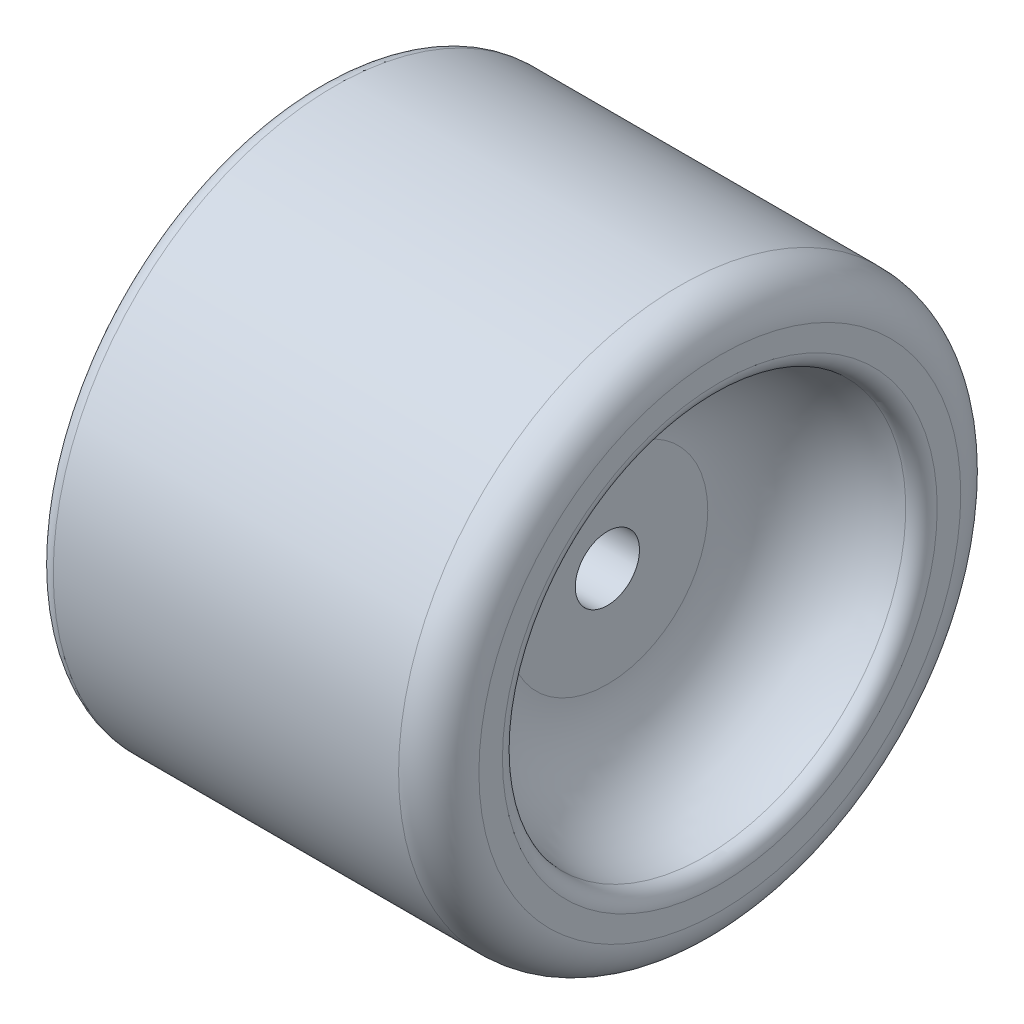
ISO-10303-21;
HEADER;
FILE_DESCRIPTION(('STEP AP214'),'2;1');
FILE_NAME('part.step','',(''),(''),'','','');
FILE_SCHEMA(('AUTOMOTIVE_DESIGN { 1 0 10303 214 1 1 1 1 }'));
ENDSEC;
DATA;
#1=APPLICATION_CONTEXT('core data for automotive mechanical design processes');
#2=APPLICATION_PROTOCOL_DEFINITION('international standard','automotive_design',2000,#1);
#3=PRODUCT_CONTEXT('',#1,'mechanical');
#4=PRODUCT('Part','Part','',(#3));
#5=PRODUCT_RELATED_PRODUCT_CATEGORY('part','',(#4));
#6=PRODUCT_DEFINITION_FORMATION('','',#4);
#7=PRODUCT_DEFINITION_CONTEXT('part definition',#1,'design');
#8=PRODUCT_DEFINITION('design','',#6,#7);
#9=PRODUCT_DEFINITION_SHAPE('','',#8);
#10=(LENGTH_UNIT() NAMED_UNIT(*) SI_UNIT(.MILLI.,.METRE.));
#11=(NAMED_UNIT(*) PLANE_ANGLE_UNIT() SI_UNIT($,.RADIAN.));
#12=(NAMED_UNIT(*) SI_UNIT($,.STERADIAN.) SOLID_ANGLE_UNIT());
#13=UNCERTAINTY_MEASURE_WITH_UNIT(LENGTH_MEASURE(1.E-05),#10,'distance_accuracy_value','');
#14=(GEOMETRIC_REPRESENTATION_CONTEXT(3) GLOBAL_UNCERTAINTY_ASSIGNED_CONTEXT((#13)) GLOBAL_UNIT_ASSIGNED_CONTEXT((#10,
#11,#12)) REPRESENTATION_CONTEXT('',''));
#15=CARTESIAN_POINT('',(0.,0.,0.));
#16=DIRECTION('',(0.,0.,1.));
#17=DIRECTION('',(1.,0.,0.));
#18=AXIS2_PLACEMENT_3D('',#15,#16,#17);
#19=CARTESIAN_POINT('',(0.,12.5,0.));
#20=DIRECTION('',(1.,0.,0.));
#21=DIRECTION('',(0.,0.,-1.));
#22=AXIS2_PLACEMENT_3D('',#19,#20,#21);
#23=PLANE('',#22);
#24=CARTESIAN_POINT('',(0.,0.,0.));
#25=DIRECTION('',(-1.,0.,0.));
#26=DIRECTION('',(0.,0.,1.));
#27=AXIS2_PLACEMENT_3D('',#24,#25,#26);
#28=CIRCLE('',#27,4.);
#29=CARTESIAN_POINT('',(0.,0.,4.));
#30=VERTEX_POINT('',#29);
#31=EDGE_CURVE('E10',#30,#30,#28,.T.);
#32=ORIENTED_EDGE('',*,*,#31,.T.);
#33=EDGE_LOOP('',(#32));
#34=FACE_BOUND('',#33,.T.);
#35=CARTESIAN_POINT('',(0.,0.,0.));
#36=DIRECTION('',(-1.,0.,0.));
#37=DIRECTION('',(0.,0.,1.));
#38=AXIS2_PLACEMENT_3D('',#35,#36,#37);
#39=CIRCLE('',#38,12.5);
#40=CARTESIAN_POINT('',(0.,0.,12.5));
#41=VERTEX_POINT('',#40);
#42=EDGE_CURVE('E76',#41,#41,#39,.T.);
#43=ORIENTED_EDGE('',*,*,#42,.F.);
#44=EDGE_LOOP('',(#43));
#45=FACE_BOUND('',#44,.T.);
#46=ADVANCED_FACE('F30',(#34,#45),#23,.T.);
#47=CARTESIAN_POINT('',(14.0021058648612,0.,0.));
#48=DIRECTION('',(-1.,0.,0.));
#49=DIRECTION('',(0.,0.,1.));
#50=AXIS2_PLACEMENT_3D('',#47,#48,#49);
#51=CYLINDRICAL_SURFACE('',#50,4.);
#52=CARTESIAN_POINT('',(-22.,0.,0.));
#53=DIRECTION('',(-1.,0.,0.));
#54=DIRECTION('',(0.,0.,1.));
#55=AXIS2_PLACEMENT_3D('',#52,#53,#54);
#56=CIRCLE('',#55,4.);
#57=CARTESIAN_POINT('',(-22.,0.,4.));
#58=VERTEX_POINT('',#57);
#59=EDGE_CURVE('E36',#58,#58,#56,.T.);
#60=ORIENTED_EDGE('',*,*,#59,.T.);
#61=EDGE_LOOP('',(#60));
#62=FACE_BOUND('',#61,.T.);
#63=ORIENTED_EDGE('',*,*,#31,.F.);
#64=EDGE_LOOP('',(#63));
#65=FACE_BOUND('',#64,.T.);
#66=ADVANCED_FACE('F84',(#62,#65),#51,.F.);
#67=CARTESIAN_POINT('',(-22.,4.,0.));
#68=DIRECTION('',(-1.,0.,0.));
#69=DIRECTION('',(0.,0.,1.));
#70=AXIS2_PLACEMENT_3D('',#67,#68,#69);
#71=PLANE('',#70);
#72=CARTESIAN_POINT('',(-22.,0.,0.));
#73=DIRECTION('',(-1.,0.,0.));
#74=DIRECTION('',(0.,0.,1.));
#75=AXIS2_PLACEMENT_3D('',#72,#73,#74);
#76=CIRCLE('',#75,12.5);
#77=CARTESIAN_POINT('',(-22.,0.,12.5));
#78=VERTEX_POINT('',#77);
#79=EDGE_CURVE('E40',#78,#78,#76,.T.);
#80=ORIENTED_EDGE('',*,*,#79,.T.);
#81=EDGE_LOOP('',(#80));
#82=FACE_BOUND('',#81,.T.);
#83=ORIENTED_EDGE('',*,*,#59,.F.);
#84=EDGE_LOOP('',(#83));
#85=FACE_BOUND('',#84,.T.);
#86=ADVANCED_FACE('F88',(#82,#85),#71,.T.);
#87=CARTESIAN_POINT('',(14.0021058648612,0.,0.));
#88=DIRECTION('',(-1.,0.,0.));
#89=DIRECTION('',(0.,0.,1.));
#90=AXIS2_PLACEMENT_3D('',#87,#88,#89);
#91=CYLINDRICAL_SURFACE('',#90,12.5);
#92=CARTESIAN_POINT('',(-24.5624014652638,0.,0.));
#93=DIRECTION('',(-1.,0.,0.));
#94=DIRECTION('',(0.,0.,1.));
#95=AXIS2_PLACEMENT_3D('',#92,#93,#94);
#96=CIRCLE('',#95,12.5);
#97=CARTESIAN_POINT('',(-24.5624014652638,0.,12.5));
#98=VERTEX_POINT('',#97);
#99=EDGE_CURVE('E44',#98,#98,#96,.T.);
#100=ORIENTED_EDGE('',*,*,#99,.T.);
#101=EDGE_LOOP('',(#100));
#102=FACE_BOUND('',#101,.T.);
#103=ORIENTED_EDGE('',*,*,#79,.F.);
#104=EDGE_LOOP('',(#103));
#105=FACE_BOUND('',#104,.T.);
#106=ADVANCED_FACE('F92',(#102,#105),#91,.F.);
#107=CARTESIAN_POINT('',(-24.5624014652638,0.,0.));
#108=DIRECTION('',(-1.,0.,0.));
#109=DIRECTION('',(0.,0.,1.));
#110=AXIS2_PLACEMENT_3D('',#107,#108,#109);
#111=TOROIDAL_SURFACE('',#110,13.,0.5);
#112=CARTESIAN_POINT('',(-25.057251331534,0.,0.));
#113=DIRECTION('',(-1.,0.,0.));
#114=DIRECTION('',(0.,0.,1.));
#115=AXIS2_PLACEMENT_3D('',#112,#113,#114);
#116=CIRCLE('',#115,12.9284206045543);
#117=CARTESIAN_POINT('',(-25.057251331534,0.,12.9284206045543));
#118=VERTEX_POINT('',#117);
#119=EDGE_CURVE('E49',#118,#118,#116,.T.);
#120=ORIENTED_EDGE('',*,*,#119,.T.);
#121=EDGE_LOOP('',(#120));
#122=FACE_BOUND('',#121,.T.);
#123=ORIENTED_EDGE('',*,*,#99,.F.);
#124=EDGE_LOOP('',(#123));
#125=FACE_BOUND('',#124,.T.);
#126=ADVANCED_FACE('F99',(#122,#125),#111,.T.);
#127=CARTESIAN_POINT('',(-44.8512459823416,0.,0.));
#128=DIRECTION('',(-1.,0.,0.));
#129=DIRECTION('',(0.,0.,1.));
#130=AXIS2_PLACEMENT_3D('',#127,#128,#129);
#131=DEGENERATE_TOROIDAL_SURFACE('',#130,10.0652447867253,20.,.T.);
#132=CARTESIAN_POINT('',(-34.9864769074856,0.,0.));
#133=DIRECTION('',(-1.,0.,0.));
#134=DIRECTION('',(0.,0.,1.));
#135=AXIS2_PLACEMENT_3D('',#132,#133,#134);
#136=CIRCLE('',#135,27.4631277355144);
#137=CARTESIAN_POINT('',(-34.9864769074856,0.,27.4631277355144));
#138=VERTEX_POINT('',#137);
#139=EDGE_CURVE('E52',#138,#138,#136,.T.);
#140=ORIENTED_EDGE('',*,*,#139,.T.);
#141=EDGE_LOOP('',(#140));
#142=FACE_BOUND('',#141,.T.);
#143=ORIENTED_EDGE('',*,*,#119,.F.);
#144=EDGE_LOOP('',(#143));
#145=FACE_BOUND('',#144,.T.);
#146=ADVANCED_FACE('F103',(#142,#145),#131,.F.);
#147=CARTESIAN_POINT('',(-34.,0.,0.));
#148=DIRECTION('',(-1.,0.,0.));
#149=DIRECTION('',(0.,0.,1.));
#150=AXIS2_PLACEMENT_3D('',#147,#148,#149);
#151=TOROIDAL_SURFACE('',#150,29.2029160303933,2.);
#152=CARTESIAN_POINT('',(-36.,0.,0.));
#153=DIRECTION('',(-1.,0.,0.));
#154=DIRECTION('',(0.,0.,1.));
#155=AXIS2_PLACEMENT_3D('',#152,#153,#154);
#156=CIRCLE('',#155,29.2029160303933);
#157=CARTESIAN_POINT('',(-36.,0.,29.2029160303933));
#158=VERTEX_POINT('',#157);
#159=EDGE_CURVE('E55',#158,#158,#156,.T.);
#160=ORIENTED_EDGE('',*,*,#159,.T.);
#161=EDGE_LOOP('',(#160));
#162=FACE_BOUND('',#161,.T.);
#163=ORIENTED_EDGE('',*,*,#139,.F.);
#164=EDGE_LOOP('',(#163));
#165=FACE_BOUND('',#164,.T.);
#166=ADVANCED_FACE('F107',(#162,#165),#151,.T.);
#167=CARTESIAN_POINT('',(-36.,29.2029160303933,0.));
#168=DIRECTION('',(-1.,0.,0.));
#169=DIRECTION('',(0.,0.,1.));
#170=AXIS2_PLACEMENT_3D('',#167,#168,#169);
#171=PLANE('',#170);
#172=CARTESIAN_POINT('',(-36.,0.,0.));
#173=DIRECTION('',(-1.,0.,0.));
#174=DIRECTION('',(0.,0.,1.));
#175=AXIS2_PLACEMENT_3D('',#172,#173,#174);
#176=CIRCLE('',#175,33.);
#177=CARTESIAN_POINT('',(-36.,0.,33.));
#178=VERTEX_POINT('',#177);
#179=EDGE_CURVE('E58',#178,#178,#176,.T.);
#180=ORIENTED_EDGE('',*,*,#179,.T.);
#181=EDGE_LOOP('',(#180));
#182=FACE_BOUND('',#181,.T.);
#183=ORIENTED_EDGE('',*,*,#159,.F.);
#184=EDGE_LOOP('',(#183));
#185=FACE_BOUND('',#184,.T.);
#186=ADVANCED_FACE('F111',(#182,#185),#171,.T.);
#187=CARTESIAN_POINT('',(-34.,0.,0.));
#188=DIRECTION('',(-1.,0.,0.));
#189=DIRECTION('',(0.,0.,1.));
#190=AXIS2_PLACEMENT_3D('',#187,#188,#189);
#191=TOROIDAL_SURFACE('',#190,33.,2.00000000000001);
#192=CARTESIAN_POINT('',(-34.,0.,0.));
#193=DIRECTION('',(-1.,0.,0.));
#194=DIRECTION('',(0.,0.,1.));
#195=AXIS2_PLACEMENT_3D('',#192,#193,#194);
#196=CIRCLE('',#195,35.);
#197=CARTESIAN_POINT('',(-34.,0.,35.));
#198=VERTEX_POINT('',#197);
#199=EDGE_CURVE('E61',#198,#198,#196,.T.);
#200=ORIENTED_EDGE('',*,*,#199,.T.);
#201=EDGE_LOOP('',(#200));
#202=FACE_BOUND('',#201,.T.);
#203=ORIENTED_EDGE('',*,*,#179,.F.);
#204=EDGE_LOOP('',(#203));
#205=FACE_BOUND('',#204,.T.);
#206=ADVANCED_FACE('F115',(#202,#205),#191,.T.);
#207=CARTESIAN_POINT('',(14.0021058648612,0.,0.));
#208=DIRECTION('',(-1.,0.,0.));
#209=DIRECTION('',(0.,0.,1.));
#210=AXIS2_PLACEMENT_3D('',#207,#208,#209);
#211=CYLINDRICAL_SURFACE('',#210,35.);
#212=CARTESIAN_POINT('',(8.99999999999997,0.,0.));
#213=DIRECTION('',(-1.,0.,0.));
#214=DIRECTION('',(0.,0.,1.));
#215=AXIS2_PLACEMENT_3D('',#212,#213,#214);
#216=CIRCLE('',#215,35.);
#217=CARTESIAN_POINT('',(8.99999999999997,0.,35.));
#218=VERTEX_POINT('',#217);
#219=EDGE_CURVE('E64',#218,#218,#216,.T.);
#220=ORIENTED_EDGE('',*,*,#219,.T.);
#221=EDGE_LOOP('',(#220));
#222=FACE_BOUND('',#221,.T.);
#223=ORIENTED_EDGE('',*,*,#199,.F.);
#224=EDGE_LOOP('',(#223));
#225=FACE_BOUND('',#224,.T.);
#226=ADVANCED_FACE('F119',(#222,#225),#211,.T.);
#227=CARTESIAN_POINT('',(9.,0.,0.));
#228=DIRECTION('',(-1.,0.,0.));
#229=DIRECTION('',(0.,0.,1.));
#230=AXIS2_PLACEMENT_3D('',#227,#228,#229);
#231=TOROIDAL_SURFACE('',#230,30.,4.99999999999999);
#232=CARTESIAN_POINT('',(14.,0.,0.));
#233=DIRECTION('',(-1.,0.,0.));
#234=DIRECTION('',(0.,0.,1.));
#235=AXIS2_PLACEMENT_3D('',#232,#233,#234);
#236=CIRCLE('',#235,30.);
#237=CARTESIAN_POINT('',(14.,0.,30.));
#238=VERTEX_POINT('',#237);
#239=EDGE_CURVE('E67',#238,#238,#236,.T.);
#240=ORIENTED_EDGE('',*,*,#239,.T.);
#241=EDGE_LOOP('',(#240));
#242=FACE_BOUND('',#241,.T.);
#243=ORIENTED_EDGE('',*,*,#219,.F.);
#244=EDGE_LOOP('',(#243));
#245=FACE_BOUND('',#244,.T.);
#246=ADVANCED_FACE('F123',(#242,#245),#231,.T.);
#247=CARTESIAN_POINT('',(14.,30.,0.));
#248=DIRECTION('',(1.,0.,0.));
#249=DIRECTION('',(0.,0.,-1.));
#250=AXIS2_PLACEMENT_3D('',#247,#248,#249);
#251=PLANE('',#250);
#252=CARTESIAN_POINT('',(14.,0.,0.));
#253=DIRECTION('',(-1.,0.,0.));
#254=DIRECTION('',(0.,0.,1.));
#255=AXIS2_PLACEMENT_3D('',#252,#253,#254);
#256=CIRCLE('',#255,27.0688022843335);
#257=CARTESIAN_POINT('',(14.,0.,27.0688022843335));
#258=VERTEX_POINT('',#257);
#259=EDGE_CURVE('E70',#258,#258,#256,.T.);
#260=ORIENTED_EDGE('',*,*,#259,.T.);
#261=EDGE_LOOP('',(#260));
#262=FACE_BOUND('',#261,.T.);
#263=ORIENTED_EDGE('',*,*,#239,.F.);
#264=EDGE_LOOP('',(#263));
#265=FACE_BOUND('',#264,.T.);
#266=ADVANCED_FACE('F127',(#262,#265),#251,.T.);
#267=CARTESIAN_POINT('',(12.,0.,0.));
#268=DIRECTION('',(-1.,0.,0.));
#269=DIRECTION('',(0.,0.,1.));
#270=AXIS2_PLACEMENT_3D('',#267,#268,#269);
#271=TOROIDAL_SURFACE('',#270,27.0688022843335,2.);
#272=CARTESIAN_POINT('',(12.0796080832823,0.,0.));
#273=DIRECTION('',(-1.,0.,0.));
#274=DIRECTION('',(0.,0.,1.));
#275=AXIS2_PLACEMENT_3D('',#272,#273,#274);
#276=CIRCLE('',#275,25.0703872741126);
#277=CARTESIAN_POINT('',(12.0796080832823,0.,25.0703872741126));
#278=VERTEX_POINT('',#277);
#279=EDGE_CURVE('E73',#278,#278,#276,.T.);
#280=ORIENTED_EDGE('',*,*,#279,.T.);
#281=EDGE_LOOP('',(#280));
#282=FACE_BOUND('',#281,.T.);
#283=ORIENTED_EDGE('',*,*,#259,.F.);
#284=EDGE_LOOP('',(#283));
#285=FACE_BOUND('',#284,.T.);
#286=ADVANCED_FACE('F131',(#282,#285),#271,.T.);
#287=CARTESIAN_POINT('',(12.5803571428571,0.,0.));
#288=DIRECTION('',(-1.,0.,0.));
#289=DIRECTION('',(0.,0.,1.));
#290=AXIS2_PLACEMENT_3D('',#287,#288,#289);
#291=DEGENERATE_TOROIDAL_SURFACE('',#290,12.5,12.5803571428571,.T.);
#292=ORIENTED_EDGE('',*,*,#42,.T.);
#293=EDGE_LOOP('',(#292));
#294=FACE_BOUND('',#293,.T.);
#295=ORIENTED_EDGE('',*,*,#279,.F.);
#296=EDGE_LOOP('',(#295));
#297=FACE_BOUND('',#296,.T.);
#298=ADVANCED_FACE('F80',(#294,#297),#291,.F.);
#299=CLOSED_SHELL('',(#46,#66,#86,#106,#126,#146,#166,#186,#206,#226,#246,#266,#286,#298));
#300=MANIFOLD_SOLID_BREP('B2',#299);
#301=ADVANCED_BREP_SHAPE_REPRESENTATION('',(#18,#300),#14);
#302=SHAPE_DEFINITION_REPRESENTATION(#9,#301);
ENDSEC;
END-ISO-10303-21;
